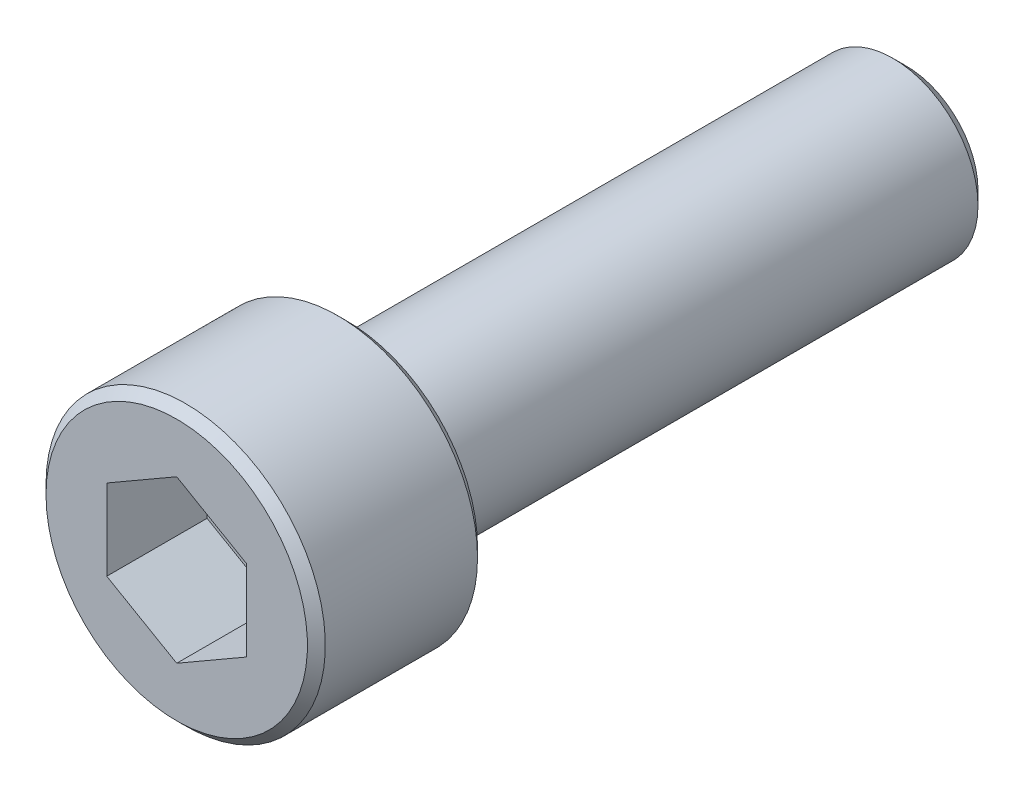
ISO-10303-21;
HEADER;
FILE_DESCRIPTION(('STEP AP214'),'2;1');
FILE_NAME('part.step','',(''),(''),'','','');
FILE_SCHEMA(('AUTOMOTIVE_DESIGN { 1 0 10303 214 1 1 1 1 }'));
ENDSEC;
DATA;
#1=APPLICATION_CONTEXT('core data for automotive mechanical design processes');
#2=APPLICATION_PROTOCOL_DEFINITION('international standard','automotive_design',2000,#1);
#3=PRODUCT_CONTEXT('',#1,'mechanical');
#4=PRODUCT('Part','Part','',(#3));
#5=PRODUCT_RELATED_PRODUCT_CATEGORY('part','',(#4));
#6=PRODUCT_DEFINITION_FORMATION('','',#4);
#7=PRODUCT_DEFINITION_CONTEXT('part definition',#1,'design');
#8=PRODUCT_DEFINITION('design','',#6,#7);
#9=PRODUCT_DEFINITION_SHAPE('','',#8);
#10=(LENGTH_UNIT() NAMED_UNIT(*) SI_UNIT(.MILLI.,.METRE.));
#11=(NAMED_UNIT(*) PLANE_ANGLE_UNIT() SI_UNIT($,.RADIAN.));
#12=(NAMED_UNIT(*) SI_UNIT($,.STERADIAN.) SOLID_ANGLE_UNIT());
#13=UNCERTAINTY_MEASURE_WITH_UNIT(LENGTH_MEASURE(1.E-05),#10,'distance_accuracy_value','');
#14=(GEOMETRIC_REPRESENTATION_CONTEXT(3) GLOBAL_UNCERTAINTY_ASSIGNED_CONTEXT((#13)) GLOBAL_UNIT_ASSIGNED_CONTEXT((#10,
#11,#12)) REPRESENTATION_CONTEXT('',''));
#15=CARTESIAN_POINT('',(0.,0.,0.));
#16=DIRECTION('',(0.,0.,1.));
#17=DIRECTION('',(1.,0.,0.));
#18=AXIS2_PLACEMENT_3D('',#15,#16,#17);
#19=CARTESIAN_POINT('',(0.,-2.29135888084633,1.9812));
#20=DIRECTION('',(0.,0.,-1.));
#21=DIRECTION('',(-1.,0.,0.));
#22=AXIS2_PLACEMENT_3D('',#19,#20,#21);
#23=PLANE('',#22);
#24=DIRECTION('',(0.,1.,0.));
#25=VECTOR('',#24,1.);
#26=CARTESIAN_POINT('',(1.984375,1.14567944042316,1.9812));
#27=LINE('',#26,#25);
#28=CARTESIAN_POINT('',(1.984375,-1.14567944042316,1.9812));
#29=VERTEX_POINT('',#28);
#30=CARTESIAN_POINT('',(1.984375,1.14567944042316,1.9812));
#31=VERTEX_POINT('',#30);
#32=EDGE_CURVE('E127',#29,#31,#27,.T.);
#33=ORIENTED_EDGE('',*,*,#32,.T.);
#34=DIRECTION('',(-0.866025403784439,0.5,0.));
#35=VECTOR('',#34,1.);
#36=CARTESIAN_POINT('',(0.,2.29135888084633,1.9812));
#37=LINE('',#36,#35);
#38=CARTESIAN_POINT('',(0.,2.29135888084633,1.9812));
#39=VERTEX_POINT('',#38);
#40=EDGE_CURVE('E132',#31,#39,#37,.T.);
#41=ORIENTED_EDGE('',*,*,#40,.T.);
#42=DIRECTION('',(-0.866025403784438,-0.500000000000001,0.));
#43=VECTOR('',#42,1.);
#44=CARTESIAN_POINT('',(-1.984375,1.14567944042316,1.9812));
#45=LINE('',#44,#43);
#46=CARTESIAN_POINT('',(-1.984375,1.14567944042316,1.9812));
#47=VERTEX_POINT('',#46);
#48=EDGE_CURVE('E136',#39,#47,#45,.T.);
#49=ORIENTED_EDGE('',*,*,#48,.T.);
#50=DIRECTION('',(0.,-1.,0.));
#51=VECTOR('',#50,1.);
#52=CARTESIAN_POINT('',(-1.984375,-1.14567944042316,1.9812));
#53=LINE('',#52,#51);
#54=CARTESIAN_POINT('',(-1.984375,-1.14567944042316,1.9812));
#55=VERTEX_POINT('',#54);
#56=EDGE_CURVE('E68',#47,#55,#53,.T.);
#57=ORIENTED_EDGE('',*,*,#56,.T.);
#58=DIRECTION('',(0.866025403784439,-0.5,0.));
#59=VECTOR('',#58,1.);
#60=CARTESIAN_POINT('',(0.,-2.29135888084633,1.9812));
#61=LINE('',#60,#59);
#62=CARTESIAN_POINT('',(0.,-2.29135888084633,1.9812));
#63=VERTEX_POINT('',#62);
#64=EDGE_CURVE('E70',#55,#63,#61,.T.);
#65=ORIENTED_EDGE('',*,*,#64,.T.);
#66=DIRECTION('',(0.866025403784439,0.5,0.));
#67=VECTOR('',#66,1.);
#68=CARTESIAN_POINT('',(1.984375,-1.14567944042316,1.9812));
#69=LINE('',#68,#67);
#70=EDGE_CURVE('E72',#63,#29,#69,.T.);
#71=ORIENTED_EDGE('',*,*,#70,.T.);
#72=EDGE_LOOP('',(#33,#41,#49,#57,#65,#71));
#73=FACE_BOUND('',#72,.T.);
#74=ADVANCED_FACE('F17',(#73),#23,.F.);
#75=CARTESIAN_POINT('',(1.984375,-1.14567944042316,1.9812));
#76=DIRECTION('',(0.5,-0.866025403784439,0.));
#77=DIRECTION('',(0.866025403784439,0.5,0.));
#78=AXIS2_PLACEMENT_3D('',#75,#76,#77);
#79=PLANE('',#78);
#80=DIRECTION('',(0.,0.,-1.));
#81=VECTOR('',#80,1.);
#82=CARTESIAN_POINT('',(1.984375,-1.14567944042316,1.9812));
#83=LINE('',#82,#81);
#84=CARTESIAN_POINT('',(1.984375,-1.14567944042316,4.826));
#85=VERTEX_POINT('',#84);
#86=EDGE_CURVE('E83',#85,#29,#83,.T.);
#87=ORIENTED_EDGE('',*,*,#86,.T.);
#88=ORIENTED_EDGE('',*,*,#70,.F.);
#89=DIRECTION('',(0.,0.,1.));
#90=VECTOR('',#89,1.);
#91=CARTESIAN_POINT('',(0.,-2.29135888084633,1.9812));
#92=LINE('',#91,#90);
#93=CARTESIAN_POINT('',(0.,-2.29135888084633,4.826));
#94=VERTEX_POINT('',#93);
#95=EDGE_CURVE('E77',#63,#94,#92,.T.);
#96=ORIENTED_EDGE('',*,*,#95,.T.);
#97=DIRECTION('',(-0.866025403784438,-0.5,0.));
#98=VECTOR('',#97,1.);
#99=CARTESIAN_POINT('',(1.984375,-1.14567944042316,4.826));
#100=LINE('',#99,#98);
#101=EDGE_CURVE('E124',#85,#94,#100,.T.);
#102=ORIENTED_EDGE('',*,*,#101,.F.);
#103=EDGE_LOOP('',(#87,#88,#96,#102));
#104=FACE_BOUND('',#103,.T.);
#105=ADVANCED_FACE('F80',(#104),#79,.F.);
#106=CARTESIAN_POINT('',(0.,-2.29135888084633,1.9812));
#107=DIRECTION('',(-0.5,-0.866025403784439,0.));
#108=DIRECTION('',(0.866025403784439,-0.5,0.));
#109=AXIS2_PLACEMENT_3D('',#106,#107,#108);
#110=PLANE('',#109);
#111=ORIENTED_EDGE('',*,*,#95,.F.);
#112=ORIENTED_EDGE('',*,*,#64,.F.);
#113=DIRECTION('',(0.,0.,1.));
#114=VECTOR('',#113,1.);
#115=CARTESIAN_POINT('',(-1.984375,-1.14567944042316,1.9812));
#116=LINE('',#115,#114);
#117=CARTESIAN_POINT('',(-1.984375,-1.14567944042316,4.826));
#118=VERTEX_POINT('',#117);
#119=EDGE_CURVE('E91',#55,#118,#116,.T.);
#120=ORIENTED_EDGE('',*,*,#119,.T.);
#121=DIRECTION('',(-0.866025403784439,0.5,0.));
#122=VECTOR('',#121,1.);
#123=CARTESIAN_POINT('',(0.,-2.29135888084633,4.826));
#124=LINE('',#123,#122);
#125=EDGE_CURVE('E88',#94,#118,#124,.T.);
#126=ORIENTED_EDGE('',*,*,#125,.F.);
#127=EDGE_LOOP('',(#111,#112,#120,#126));
#128=FACE_BOUND('',#127,.T.);
#129=ADVANCED_FACE('F86',(#128),#110,.F.);
#130=CARTESIAN_POINT('',(-1.984375,-1.14567944042316,1.9812));
#131=DIRECTION('',(-1.,0.,0.));
#132=DIRECTION('',(0.,-1.,0.));
#133=AXIS2_PLACEMENT_3D('',#130,#131,#132);
#134=PLANE('',#133);
#135=ORIENTED_EDGE('',*,*,#119,.F.);
#136=ORIENTED_EDGE('',*,*,#56,.F.);
#137=DIRECTION('',(0.,0.,1.));
#138=VECTOR('',#137,1.);
#139=CARTESIAN_POINT('',(-1.984375,1.14567944042316,1.9812));
#140=LINE('',#139,#138);
#141=CARTESIAN_POINT('',(-1.984375,1.14567944042316,4.826));
#142=VERTEX_POINT('',#141);
#143=EDGE_CURVE('E134',#47,#142,#140,.T.);
#144=ORIENTED_EDGE('',*,*,#143,.T.);
#145=DIRECTION('',(0.,1.,0.));
#146=VECTOR('',#145,1.);
#147=CARTESIAN_POINT('',(-1.984375,0.,4.826));
#148=LINE('',#147,#146);
#149=EDGE_CURVE('E120',#118,#142,#148,.T.);
#150=ORIENTED_EDGE('',*,*,#149,.F.);
#151=EDGE_LOOP('',(#135,#136,#144,#150));
#152=FACE_BOUND('',#151,.T.);
#153=ADVANCED_FACE('F139',(#152),#134,.F.);
#154=CARTESIAN_POINT('',(-1.984375,1.14567944042316,1.9812));
#155=DIRECTION('',(-0.500000000000001,0.866025403784438,0.));
#156=DIRECTION('',(-0.866025403784438,-0.500000000000001,0.));
#157=AXIS2_PLACEMENT_3D('',#154,#155,#156);
#158=PLANE('',#157);
#159=ORIENTED_EDGE('',*,*,#143,.F.);
#160=ORIENTED_EDGE('',*,*,#48,.F.);
#161=DIRECTION('',(0.,0.,1.));
#162=VECTOR('',#161,1.);
#163=CARTESIAN_POINT('',(0.,2.29135888084633,1.9812));
#164=LINE('',#163,#162);
#165=CARTESIAN_POINT('',(0.,2.29135888084633,4.826));
#166=VERTEX_POINT('',#165);
#167=EDGE_CURVE('E130',#39,#166,#164,.T.);
#168=ORIENTED_EDGE('',*,*,#167,.T.);
#169=DIRECTION('',(0.866025403784438,0.5,0.));
#170=VECTOR('',#169,1.);
#171=CARTESIAN_POINT('',(-1.984375,1.14567944042316,4.826));
#172=LINE('',#171,#170);
#173=EDGE_CURVE('E117',#142,#166,#172,.T.);
#174=ORIENTED_EDGE('',*,*,#173,.F.);
#175=EDGE_LOOP('',(#159,#160,#168,#174));
#176=FACE_BOUND('',#175,.T.);
#177=ADVANCED_FACE('F151',(#176),#158,.F.);
#178=CARTESIAN_POINT('',(0.,2.29135888084633,1.9812));
#179=DIRECTION('',(0.5,0.866025403784439,0.));
#180=DIRECTION('',(-0.866025403784439,0.5,0.));
#181=AXIS2_PLACEMENT_3D('',#178,#179,#180);
#182=PLANE('',#181);
#183=ORIENTED_EDGE('',*,*,#167,.F.);
#184=ORIENTED_EDGE('',*,*,#40,.F.);
#185=DIRECTION('',(0.,0.,-1.));
#186=VECTOR('',#185,1.);
#187=CARTESIAN_POINT('',(1.984375,1.14567944042316,1.9812));
#188=LINE('',#187,#186);
#189=CARTESIAN_POINT('',(1.984375,1.14567944042316,4.826));
#190=VERTEX_POINT('',#189);
#191=EDGE_CURVE('E35',#31,#190,#188,.F.);
#192=ORIENTED_EDGE('',*,*,#191,.T.);
#193=DIRECTION('',(0.866025403784439,-0.5,0.));
#194=VECTOR('',#193,1.);
#195=CARTESIAN_POINT('',(0.,2.29135888084633,4.826));
#196=LINE('',#195,#194);
#197=EDGE_CURVE('E114',#166,#190,#196,.T.);
#198=ORIENTED_EDGE('',*,*,#197,.F.);
#199=EDGE_LOOP('',(#183,#184,#192,#198));
#200=FACE_BOUND('',#199,.T.);
#201=ADVANCED_FACE('F149',(#200),#182,.F.);
#202=CARTESIAN_POINT('',(1.984375,1.14567944042316,1.9812));
#203=DIRECTION('',(1.,0.,0.));
#204=DIRECTION('',(0.,0.,-1.));
#205=AXIS2_PLACEMENT_3D('',#202,#203,#204);
#206=PLANE('',#205);
#207=ORIENTED_EDGE('',*,*,#191,.F.);
#208=ORIENTED_EDGE('',*,*,#32,.F.);
#209=ORIENTED_EDGE('',*,*,#86,.F.);
#210=DIRECTION('',(0.,1.,0.));
#211=VECTOR('',#210,1.);
#212=CARTESIAN_POINT('',(1.984375,0.,4.826));
#213=LINE('',#212,#211);
#214=EDGE_CURVE('E111',#190,#85,#213,.F.);
#215=ORIENTED_EDGE('',*,*,#214,.F.);
#216=EDGE_LOOP('',(#207,#208,#209,#215));
#217=FACE_BOUND('',#216,.T.);
#218=ADVANCED_FACE('F146',(#217),#206,.F.);
#219=CARTESIAN_POINT('',(0.,0.,4.826));
#220=DIRECTION('',(0.,0.,1.));
#221=DIRECTION('',(1.,0.,0.));
#222=AXIS2_PLACEMENT_3D('',#219,#220,#221);
#223=PLANE('',#222);
#224=ORIENTED_EDGE('',*,*,#197,.T.);
#225=ORIENTED_EDGE('',*,*,#214,.T.);
#226=ORIENTED_EDGE('',*,*,#101,.T.);
#227=ORIENTED_EDGE('',*,*,#125,.T.);
#228=ORIENTED_EDGE('',*,*,#149,.T.);
#229=ORIENTED_EDGE('',*,*,#173,.T.);
#230=EDGE_LOOP('',(#224,#225,#226,#227,#228,#229));
#231=FACE_BOUND('',#230,.T.);
#232=CARTESIAN_POINT('',(0.,0.,4.82599999998001));
#233=DIRECTION('',(0.,0.,-1.));
#234=DIRECTION('',(-1.,0.,0.));
#235=AXIS2_PLACEMENT_3D('',#232,#233,#234);
#236=CIRCLE('',#235,3.70839999999362);
#237=CARTESIAN_POINT('',(-3.70839999999362,0.,4.82599999998001));
#238=VERTEX_POINT('',#237);
#239=EDGE_CURVE('E20',#238,#238,#236,.T.);
#240=ORIENTED_EDGE('',*,*,#239,.F.);
#241=EDGE_LOOP('',(#240));
#242=FACE_BOUND('',#241,.T.);
#243=ADVANCED_FACE('F143',(#231,#242),#223,.T.);
#244=CARTESIAN_POINT('',(0.,0.,4.57199999999602));
#245=DIRECTION('',(0.,0.,-1.));
#246=DIRECTION('',(-1.,0.,0.));
#247=AXIS2_PLACEMENT_3D('',#244,#245,#246);
#248=CONICAL_SURFACE('',#247,3.96239999997761,0.785398163397448);
#249=ORIENTED_EDGE('',*,*,#239,.T.);
#250=EDGE_LOOP('',(#249));
#251=FACE_BOUND('',#250,.T.);
#252=CARTESIAN_POINT('',(0.,0.,4.572));
#253=DIRECTION('',(0.,0.,-1.));
#254=DIRECTION('',(-1.,0.,0.));
#255=AXIS2_PLACEMENT_3D('',#252,#253,#254);
#256=CIRCLE('',#255,3.9624);
#257=CARTESIAN_POINT('',(-3.9624,0.,4.572));
#258=VERTEX_POINT('',#257);
#259=EDGE_CURVE('E103',#258,#258,#256,.T.);
#260=ORIENTED_EDGE('',*,*,#259,.F.);
#261=EDGE_LOOP('',(#260));
#262=FACE_BOUND('',#261,.T.);
#263=ADVANCED_FACE('F188',(#251,#262),#248,.T.);
#264=CARTESIAN_POINT('',(0.,0.,4.826));
#265=DIRECTION('',(0.,0.,-1.));
#266=DIRECTION('',(-1.,0.,0.));
#267=AXIS2_PLACEMENT_3D('',#264,#265,#266);
#268=CYLINDRICAL_SURFACE('',#267,3.9624);
#269=ORIENTED_EDGE('',*,*,#259,.T.);
#270=EDGE_LOOP('',(#269));
#271=FACE_BOUND('',#270,.T.);
#272=CARTESIAN_POINT('',(0.,0.,0.254000000040833));
#273=DIRECTION('',(0.,0.,1.));
#274=DIRECTION('',(1.,0.,0.));
#275=AXIS2_PLACEMENT_3D('',#272,#273,#274);
#276=CIRCLE('',#275,3.96239999997761);
#277=CARTESIAN_POINT('',(3.96239999997761,0.,0.254000000040833));
#278=VERTEX_POINT('',#277);
#279=EDGE_CURVE('E99',#278,#278,#276,.F.);
#280=ORIENTED_EDGE('',*,*,#279,.F.);
#281=EDGE_LOOP('',(#280));
#282=FACE_BOUND('',#281,.T.);
#283=ADVANCED_FACE('F184',(#271,#282),#268,.T.);
#284=CARTESIAN_POINT('',(0.,0.,-15.875));
#285=DIRECTION('',(0.,0.,1.));
#286=DIRECTION('',(1.,0.,0.));
#287=AXIS2_PLACEMENT_3D('',#284,#285,#286);
#288=PLANE('',#287);
#289=CARTESIAN_POINT('',(0.,0.,-15.8749999999941));
#290=DIRECTION('',(0.,0.,1.));
#291=DIRECTION('',(1.,0.,0.));
#292=AXIS2_PLACEMENT_3D('',#289,#290,#291);
#293=CIRCLE('',#292,2.03199999992876);
#294=CARTESIAN_POINT('',(2.03199999992876,0.,-15.8749999999941));
#295=VERTEX_POINT('',#294);
#296=EDGE_CURVE('E97',#295,#295,#293,.T.);
#297=ORIENTED_EDGE('',*,*,#296,.F.);
#298=EDGE_LOOP('',(#297));
#299=FACE_BOUND('',#298,.T.);
#300=ADVANCED_FACE('F180',(#299),#288,.F.);
#301=CARTESIAN_POINT('',(0.,0.,0.253999999927146));
#302=DIRECTION('',(0.,0.,1.));
#303=DIRECTION('',(1.,0.,0.));
#304=AXIS2_PLACEMENT_3D('',#301,#302,#303);
#305=CONICAL_SURFACE('',#304,3.96239999992076,0.785398163397448);
#306=CARTESIAN_POINT('',(0.,0.,5.6843418860808E-11));
#307=DIRECTION('',(0.,0.,1.));
#308=DIRECTION('',(1.,0.,0.));
#309=AXIS2_PLACEMENT_3D('',#306,#307,#308);
#310=CIRCLE('',#309,3.70840000005046);
#311=CARTESIAN_POINT('',(3.70840000005046,0.,5.6843418860808E-11));
#312=VERTEX_POINT('',#311);
#313=EDGE_CURVE('E95',#312,#312,#310,.T.);
#314=ORIENTED_EDGE('',*,*,#313,.T.);
#315=EDGE_LOOP('',(#314));
#316=FACE_BOUND('',#315,.T.);
#317=ORIENTED_EDGE('',*,*,#279,.T.);
#318=EDGE_LOOP('',(#317));
#319=FACE_BOUND('',#318,.T.);
#320=ADVANCED_FACE('F176',(#316,#319),#305,.T.);
#321=CARTESIAN_POINT('',(0.,0.,-15.4940000001034));
#322=DIRECTION('',(0.,0.,1.));
#323=DIRECTION('',(1.,0.,0.));
#324=AXIS2_PLACEMENT_3D('',#321,#322,#323);
#325=CONICAL_SURFACE('',#324,2.41299999987632,0.785398163472046);
#326=CARTESIAN_POINT('',(0.,0.,-15.494));
#327=DIRECTION('',(0.,0.,1.));
#328=DIRECTION('',(1.,0.,0.));
#329=AXIS2_PLACEMENT_3D('',#326,#327,#328);
#330=CIRCLE('',#329,2.413);
#331=CARTESIAN_POINT('',(2.413,0.,-15.494));
#332=VERTEX_POINT('',#331);
#333=EDGE_CURVE('E26',#332,#332,#330,.T.);
#334=ORIENTED_EDGE('',*,*,#333,.F.);
#335=EDGE_LOOP('',(#334));
#336=FACE_BOUND('',#335,.T.);
#337=ORIENTED_EDGE('',*,*,#296,.T.);
#338=EDGE_LOOP('',(#337));
#339=FACE_BOUND('',#338,.T.);
#340=ADVANCED_FACE('F169',(#336,#339),#325,.T.);
#341=CARTESIAN_POINT('',(0.,0.,0.));
#342=DIRECTION('',(0.,0.,1.));
#343=DIRECTION('',(1.,0.,0.));
#344=AXIS2_PLACEMENT_3D('',#341,#342,#343);
#345=PLANE('',#344);
#346=CARTESIAN_POINT('',(0.,0.,0.));
#347=DIRECTION('',(0.,0.,1.));
#348=DIRECTION('',(1.,0.,0.));
#349=AXIS2_PLACEMENT_3D('',#346,#347,#348);
#350=CIRCLE('',#349,2.413);
#351=CARTESIAN_POINT('',(2.413,0.,0.));
#352=VERTEX_POINT('',#351);
#353=EDGE_CURVE('E11',#352,#352,#350,.F.);
#354=ORIENTED_EDGE('',*,*,#353,.F.);
#355=EDGE_LOOP('',(#354));
#356=FACE_BOUND('',#355,.T.);
#357=ORIENTED_EDGE('',*,*,#313,.F.);
#358=EDGE_LOOP('',(#357));
#359=FACE_BOUND('',#358,.T.);
#360=ADVANCED_FACE('F163',(#356,#359),#345,.F.);
#361=CARTESIAN_POINT('',(0.,0.,-15.875));
#362=DIRECTION('',(0.,0.,1.));
#363=DIRECTION('',(1.,0.,0.));
#364=AXIS2_PLACEMENT_3D('',#361,#362,#363);
#365=CYLINDRICAL_SURFACE('',#364,2.413);
#366=ORIENTED_EDGE('',*,*,#353,.T.);
#367=EDGE_LOOP('',(#366));
#368=FACE_BOUND('',#367,.T.);
#369=ORIENTED_EDGE('',*,*,#333,.T.);
#370=EDGE_LOOP('',(#369));
#371=FACE_BOUND('',#370,.T.);
#372=ADVANCED_FACE('F161',(#368,#371),#365,.T.);
#373=CLOSED_SHELL('',(#74,#105,#129,#153,#177,#201,#218,#243,#263,#283,#300,#320,#340,#360,#372));
#374=MANIFOLD_SOLID_BREP('B1',#373);
#375=ADVANCED_BREP_SHAPE_REPRESENTATION('',(#18,#374),#14);
#376=SHAPE_DEFINITION_REPRESENTATION(#9,#375);
ENDSEC;
END-ISO-10303-21;
